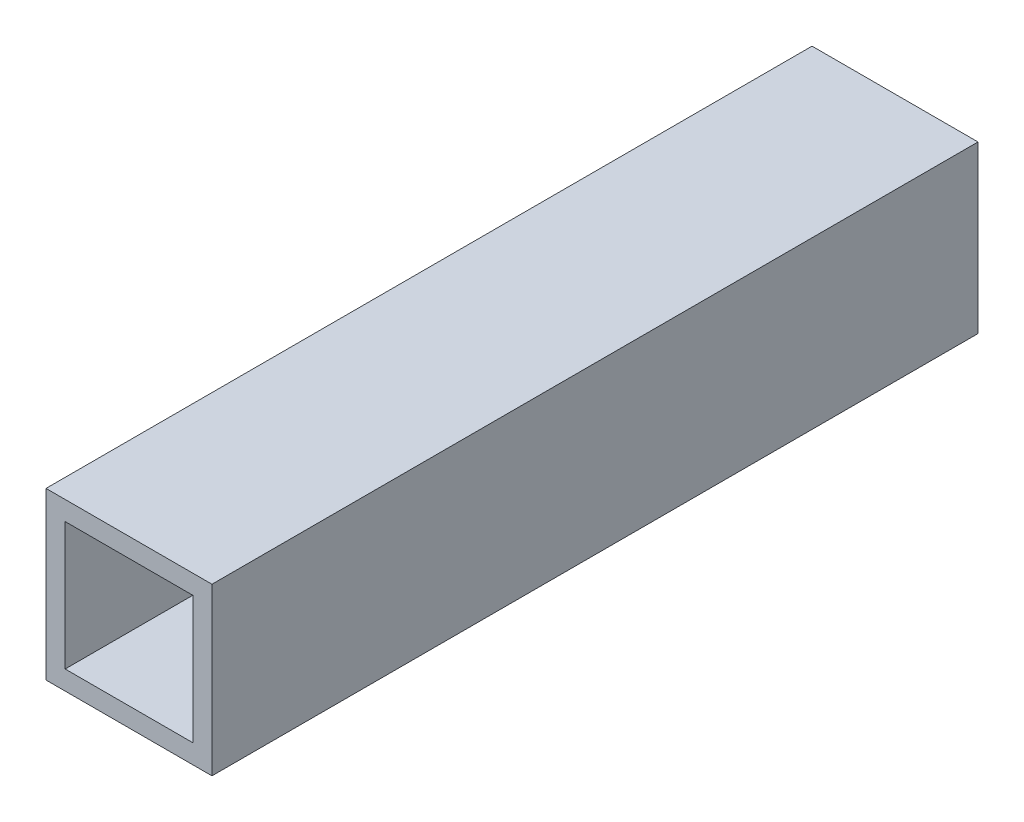
ISO-10303-21;
HEADER;
FILE_DESCRIPTION(('STEP AP214'),'2;1');
FILE_NAME('part.step','',(''),(''),'','','');
FILE_SCHEMA(('AUTOMOTIVE_DESIGN { 1 0 10303 214 1 1 1 1 }'));
ENDSEC;
DATA;
#1=APPLICATION_CONTEXT('core data for automotive mechanical design processes');
#2=APPLICATION_PROTOCOL_DEFINITION('international standard','automotive_design',2000,#1);
#3=PRODUCT_CONTEXT('',#1,'mechanical');
#4=PRODUCT('Part','Part','',(#3));
#5=PRODUCT_RELATED_PRODUCT_CATEGORY('part','',(#4));
#6=PRODUCT_DEFINITION_FORMATION('','',#4);
#7=PRODUCT_DEFINITION_CONTEXT('part definition',#1,'design');
#8=PRODUCT_DEFINITION('design','',#6,#7);
#9=PRODUCT_DEFINITION_SHAPE('','',#8);
#10=(LENGTH_UNIT() NAMED_UNIT(*) SI_UNIT(.MILLI.,.METRE.));
#11=(NAMED_UNIT(*) PLANE_ANGLE_UNIT() SI_UNIT($,.RADIAN.));
#12=(NAMED_UNIT(*) SI_UNIT($,.STERADIAN.) SOLID_ANGLE_UNIT());
#13=UNCERTAINTY_MEASURE_WITH_UNIT(LENGTH_MEASURE(1.E-05),#10,'distance_accuracy_value','');
#14=(GEOMETRIC_REPRESENTATION_CONTEXT(3) GLOBAL_UNCERTAINTY_ASSIGNED_CONTEXT((#13)) GLOBAL_UNIT_ASSIGNED_CONTEXT((#10,
#11,#12)) REPRESENTATION_CONTEXT('',''));
#15=CARTESIAN_POINT('',(0.,0.,0.));
#16=DIRECTION('',(0.,0.,1.));
#17=DIRECTION('',(1.,0.,0.));
#18=AXIS2_PLACEMENT_3D('',#15,#16,#17);
#19=CARTESIAN_POINT('',(0.,0.,60.));
#20=DIRECTION('',(0.,0.,1.));
#21=DIRECTION('',(1.,0.,0.));
#22=AXIS2_PLACEMENT_3D('',#19,#20,#21);
#23=PLANE('',#22);
#24=DIRECTION('',(0.,1.,0.));
#25=VECTOR('',#24,1.);
#26=CARTESIAN_POINT('',(6.5,6.5,60.));
#27=LINE('',#26,#25);
#28=CARTESIAN_POINT('',(6.5,-6.5,60.));
#29=VERTEX_POINT('',#28);
#30=CARTESIAN_POINT('',(6.5,6.5,60.));
#31=VERTEX_POINT('',#30);
#32=EDGE_CURVE('E136',#29,#31,#27,.T.);
#33=ORIENTED_EDGE('',*,*,#32,.T.);
#34=DIRECTION('',(-1.,0.,0.));
#35=VECTOR('',#34,1.);
#36=CARTESIAN_POINT('',(-6.5,6.5,60.));
#37=LINE('',#36,#35);
#38=CARTESIAN_POINT('',(-6.5,6.5,60.));
#39=VERTEX_POINT('',#38);
#40=EDGE_CURVE('E139',#31,#39,#37,.T.);
#41=ORIENTED_EDGE('',*,*,#40,.T.);
#42=DIRECTION('',(0.,-1.,0.));
#43=VECTOR('',#42,1.);
#44=CARTESIAN_POINT('',(-6.5,6.5,60.));
#45=LINE('',#44,#43);
#46=CARTESIAN_POINT('',(-6.5,-6.5,60.));
#47=VERTEX_POINT('',#46);
#48=EDGE_CURVE('E142',#39,#47,#45,.T.);
#49=ORIENTED_EDGE('',*,*,#48,.T.);
#50=DIRECTION('',(1.,0.,0.));
#51=VECTOR('',#50,1.);
#52=CARTESIAN_POINT('',(-6.5,-6.5,60.));
#53=LINE('',#52,#51);
#54=EDGE_CURVE('E144',#47,#29,#53,.T.);
#55=ORIENTED_EDGE('',*,*,#54,.T.);
#56=EDGE_LOOP('',(#33,#41,#49,#55));
#57=FACE_BOUND('',#56,.T.);
#58=DIRECTION('',(-1.,0.,0.));
#59=VECTOR('',#58,1.);
#60=CARTESIAN_POINT('',(-5.,5.00000000000001,60.));
#61=LINE('',#60,#59);
#62=CARTESIAN_POINT('',(5.,5.00000000000001,60.));
#63=VERTEX_POINT('',#62);
#64=CARTESIAN_POINT('',(-5.,5.00000000000001,60.));
#65=VERTEX_POINT('',#64);
#66=EDGE_CURVE('E108',#63,#65,#61,.T.);
#67=ORIENTED_EDGE('',*,*,#66,.F.);
#68=DIRECTION('',(0.,1.,0.));
#69=VECTOR('',#68,1.);
#70=CARTESIAN_POINT('',(5.,-5.,60.));
#71=LINE('',#70,#69);
#72=CARTESIAN_POINT('',(5.,-5.,60.));
#73=VERTEX_POINT('',#72);
#74=EDGE_CURVE('E100',#73,#63,#71,.T.);
#75=ORIENTED_EDGE('',*,*,#74,.F.);
#76=DIRECTION('',(1.,0.,0.));
#77=VECTOR('',#76,1.);
#78=CARTESIAN_POINT('',(-5.,-5.,60.));
#79=LINE('',#78,#77);
#80=CARTESIAN_POINT('',(-5.,-5.,60.));
#81=VERTEX_POINT('',#80);
#82=EDGE_CURVE('E122',#81,#73,#79,.T.);
#83=ORIENTED_EDGE('',*,*,#82,.F.);
#84=DIRECTION('',(0.,-1.,0.));
#85=VECTOR('',#84,1.);
#86=CARTESIAN_POINT('',(-5.,-5.,60.));
#87=LINE('',#86,#85);
#88=EDGE_CURVE('E120',#65,#81,#87,.T.);
#89=ORIENTED_EDGE('',*,*,#88,.F.);
#90=EDGE_LOOP('',(#67,#75,#83,#89));
#91=FACE_BOUND('',#90,.T.);
#92=ADVANCED_FACE('F35',(#57,#91),#23,.T.);
#93=CARTESIAN_POINT('',(0.,0.,0.));
#94=DIRECTION('',(0.,0.,1.));
#95=DIRECTION('',(1.,0.,0.));
#96=AXIS2_PLACEMENT_3D('',#93,#94,#95);
#97=PLANE('',#96);
#98=DIRECTION('',(0.,1.,0.));
#99=VECTOR('',#98,1.);
#100=CARTESIAN_POINT('',(6.5,6.5,0.));
#101=LINE('',#100,#99);
#102=CARTESIAN_POINT('',(6.5,-6.5,0.));
#103=VERTEX_POINT('',#102);
#104=CARTESIAN_POINT('',(6.5,6.5,0.));
#105=VERTEX_POINT('',#104);
#106=EDGE_CURVE('E116',#103,#105,#101,.T.);
#107=ORIENTED_EDGE('',*,*,#106,.F.);
#108=DIRECTION('',(1.,0.,0.));
#109=VECTOR('',#108,1.);
#110=CARTESIAN_POINT('',(-6.5,-6.5,0.));
#111=LINE('',#110,#109);
#112=CARTESIAN_POINT('',(-6.5,-6.5,0.));
#113=VERTEX_POINT('',#112);
#114=EDGE_CURVE('E140',#113,#103,#111,.T.);
#115=ORIENTED_EDGE('',*,*,#114,.F.);
#116=DIRECTION('',(0.,-1.,0.));
#117=VECTOR('',#116,1.);
#118=CARTESIAN_POINT('',(-6.5,6.5,0.));
#119=LINE('',#118,#117);
#120=CARTESIAN_POINT('',(-6.5,6.5,0.));
#121=VERTEX_POINT('',#120);
#122=EDGE_CURVE('E151',#121,#113,#119,.T.);
#123=ORIENTED_EDGE('',*,*,#122,.F.);
#124=DIRECTION('',(-1.,0.,0.));
#125=VECTOR('',#124,1.);
#126=CARTESIAN_POINT('',(-6.5,6.5,0.));
#127=LINE('',#126,#125);
#128=EDGE_CURVE('E149',#105,#121,#127,.T.);
#129=ORIENTED_EDGE('',*,*,#128,.F.);
#130=EDGE_LOOP('',(#107,#115,#123,#129));
#131=FACE_BOUND('',#130,.T.);
#132=DIRECTION('',(0.,1.,0.));
#133=VECTOR('',#132,1.);
#134=CARTESIAN_POINT('',(5.,-5.,0.));
#135=LINE('',#134,#133);
#136=CARTESIAN_POINT('',(5.,-5.,0.));
#137=VERTEX_POINT('',#136);
#138=CARTESIAN_POINT('',(5.,5.00000000000001,0.));
#139=VERTEX_POINT('',#138);
#140=EDGE_CURVE('E58',#137,#139,#135,.T.);
#141=ORIENTED_EDGE('',*,*,#140,.T.);
#142=DIRECTION('',(-1.,0.,0.));
#143=VECTOR('',#142,1.);
#144=CARTESIAN_POINT('',(-5.,5.00000000000001,0.));
#145=LINE('',#144,#143);
#146=CARTESIAN_POINT('',(-5.,5.00000000000001,0.));
#147=VERTEX_POINT('',#146);
#148=EDGE_CURVE('E115',#139,#147,#145,.T.);
#149=ORIENTED_EDGE('',*,*,#148,.T.);
#150=DIRECTION('',(0.,-1.,0.));
#151=VECTOR('',#150,1.);
#152=CARTESIAN_POINT('',(-5.,-5.,0.));
#153=LINE('',#152,#151);
#154=CARTESIAN_POINT('',(-5.,-5.,0.));
#155=VERTEX_POINT('',#154);
#156=EDGE_CURVE('E128',#147,#155,#153,.T.);
#157=ORIENTED_EDGE('',*,*,#156,.T.);
#158=DIRECTION('',(1.,0.,0.));
#159=VECTOR('',#158,1.);
#160=CARTESIAN_POINT('',(-5.,-5.,0.));
#161=LINE('',#160,#159);
#162=EDGE_CURVE('E109',#155,#137,#161,.T.);
#163=ORIENTED_EDGE('',*,*,#162,.T.);
#164=EDGE_LOOP('',(#141,#149,#157,#163));
#165=FACE_BOUND('',#164,.T.);
#166=ADVANCED_FACE('F169',(#131,#165),#97,.F.);
#167=CARTESIAN_POINT('',(6.5,6.5,60.));
#168=DIRECTION('',(-1.,0.,0.));
#169=DIRECTION('',(0.,0.,1.));
#170=AXIS2_PLACEMENT_3D('',#167,#168,#169);
#171=PLANE('',#170);
#172=ORIENTED_EDGE('',*,*,#106,.T.);
#173=DIRECTION('',(0.,0.,-1.));
#174=VECTOR('',#173,1.);
#175=CARTESIAN_POINT('',(6.5,6.5,60.));
#176=LINE('',#175,#174);
#177=EDGE_CURVE('E11',#31,#105,#176,.T.);
#178=ORIENTED_EDGE('',*,*,#177,.F.);
#179=ORIENTED_EDGE('',*,*,#32,.F.);
#180=DIRECTION('',(0.,0.,-1.));
#181=VECTOR('',#180,1.);
#182=CARTESIAN_POINT('',(6.5,-6.5,60.));
#183=LINE('',#182,#181);
#184=EDGE_CURVE('E146',#29,#103,#183,.T.);
#185=ORIENTED_EDGE('',*,*,#184,.T.);
#186=EDGE_LOOP('',(#172,#178,#179,#185));
#187=FACE_BOUND('',#186,.T.);
#188=ADVANCED_FACE('F37',(#187),#171,.F.);
#189=CARTESIAN_POINT('',(-6.5,6.5,60.));
#190=DIRECTION('',(0.,-1.,0.));
#191=DIRECTION('',(0.,0.,-1.));
#192=AXIS2_PLACEMENT_3D('',#189,#190,#191);
#193=PLANE('',#192);
#194=ORIENTED_EDGE('',*,*,#128,.T.);
#195=DIRECTION('',(0.,0.,-1.));
#196=VECTOR('',#195,1.);
#197=CARTESIAN_POINT('',(-6.5,6.5,60.));
#198=LINE('',#197,#196);
#199=EDGE_CURVE('E43',#39,#121,#198,.T.);
#200=ORIENTED_EDGE('',*,*,#199,.F.);
#201=ORIENTED_EDGE('',*,*,#40,.F.);
#202=ORIENTED_EDGE('',*,*,#177,.T.);
#203=EDGE_LOOP('',(#194,#200,#201,#202));
#204=FACE_BOUND('',#203,.T.);
#205=ADVANCED_FACE('F179',(#204),#193,.F.);
#206=CARTESIAN_POINT('',(-6.5,6.5,60.));
#207=DIRECTION('',(1.,0.,0.));
#208=DIRECTION('',(0.,0.,-1.));
#209=AXIS2_PLACEMENT_3D('',#206,#207,#208);
#210=PLANE('',#209);
#211=ORIENTED_EDGE('',*,*,#122,.T.);
#212=DIRECTION('',(0.,0.,-1.));
#213=VECTOR('',#212,1.);
#214=CARTESIAN_POINT('',(-6.5,-6.5,60.));
#215=LINE('',#214,#213);
#216=EDGE_CURVE('E156',#47,#113,#215,.T.);
#217=ORIENTED_EDGE('',*,*,#216,.F.);
#218=ORIENTED_EDGE('',*,*,#48,.F.);
#219=ORIENTED_EDGE('',*,*,#199,.T.);
#220=EDGE_LOOP('',(#211,#217,#218,#219));
#221=FACE_BOUND('',#220,.T.);
#222=ADVANCED_FACE('F163',(#221),#210,.F.);
#223=CARTESIAN_POINT('',(-6.5,-6.5,60.));
#224=DIRECTION('',(0.,1.,0.));
#225=DIRECTION('',(0.,0.,1.));
#226=AXIS2_PLACEMENT_3D('',#223,#224,#225);
#227=PLANE('',#226);
#228=ORIENTED_EDGE('',*,*,#114,.T.);
#229=ORIENTED_EDGE('',*,*,#184,.F.);
#230=ORIENTED_EDGE('',*,*,#54,.F.);
#231=ORIENTED_EDGE('',*,*,#216,.T.);
#232=EDGE_LOOP('',(#228,#229,#230,#231));
#233=FACE_BOUND('',#232,.T.);
#234=ADVANCED_FACE('F173',(#233),#227,.F.);
#235=CARTESIAN_POINT('',(5.,-5.,60.));
#236=DIRECTION('',(-1.,0.,0.));
#237=DIRECTION('',(0.,0.,1.));
#238=AXIS2_PLACEMENT_3D('',#235,#236,#237);
#239=PLANE('',#238);
#240=ORIENTED_EDGE('',*,*,#140,.F.);
#241=DIRECTION('',(0.,0.,-1.));
#242=VECTOR('',#241,1.);
#243=CARTESIAN_POINT('',(5.,-5.,60.));
#244=LINE('',#243,#242);
#245=EDGE_CURVE('E104',#73,#137,#244,.T.);
#246=ORIENTED_EDGE('',*,*,#245,.F.);
#247=ORIENTED_EDGE('',*,*,#74,.T.);
#248=DIRECTION('',(0.,0.,-1.));
#249=VECTOR('',#248,1.);
#250=CARTESIAN_POINT('',(5.,5.00000000000001,60.));
#251=LINE('',#250,#249);
#252=EDGE_CURVE('E103',#63,#139,#251,.T.);
#253=ORIENTED_EDGE('',*,*,#252,.T.);
#254=EDGE_LOOP('',(#240,#246,#247,#253));
#255=FACE_BOUND('',#254,.T.);
#256=ADVANCED_FACE('F102',(#255),#239,.T.);
#257=CARTESIAN_POINT('',(-5.,5.00000000000001,60.));
#258=DIRECTION('',(0.,-1.,0.));
#259=DIRECTION('',(0.,0.,-1.));
#260=AXIS2_PLACEMENT_3D('',#257,#258,#259);
#261=PLANE('',#260);
#262=ORIENTED_EDGE('',*,*,#148,.F.);
#263=ORIENTED_EDGE('',*,*,#252,.F.);
#264=ORIENTED_EDGE('',*,*,#66,.T.);
#265=DIRECTION('',(0.,0.,-1.));
#266=VECTOR('',#265,1.);
#267=CARTESIAN_POINT('',(-5.,5.00000000000001,60.));
#268=LINE('',#267,#266);
#269=EDGE_CURVE('E117',#65,#147,#268,.T.);
#270=ORIENTED_EDGE('',*,*,#269,.T.);
#271=EDGE_LOOP('',(#262,#263,#264,#270));
#272=FACE_BOUND('',#271,.T.);
#273=ADVANCED_FACE('F112',(#272),#261,.T.);
#274=CARTESIAN_POINT('',(-5.,-5.,60.));
#275=DIRECTION('',(1.,0.,0.));
#276=DIRECTION('',(0.,0.,-1.));
#277=AXIS2_PLACEMENT_3D('',#274,#275,#276);
#278=PLANE('',#277);
#279=ORIENTED_EDGE('',*,*,#156,.F.);
#280=ORIENTED_EDGE('',*,*,#269,.F.);
#281=ORIENTED_EDGE('',*,*,#88,.T.);
#282=DIRECTION('',(0.,0.,-1.));
#283=VECTOR('',#282,1.);
#284=CARTESIAN_POINT('',(-5.,-5.,60.));
#285=LINE('',#284,#283);
#286=EDGE_CURVE('E50',#81,#155,#285,.T.);
#287=ORIENTED_EDGE('',*,*,#286,.T.);
#288=EDGE_LOOP('',(#279,#280,#281,#287));
#289=FACE_BOUND('',#288,.T.);
#290=ADVANCED_FACE('F202',(#289),#278,.T.);
#291=CARTESIAN_POINT('',(-5.,-5.,60.));
#292=DIRECTION('',(0.,1.,0.));
#293=DIRECTION('',(0.,0.,1.));
#294=AXIS2_PLACEMENT_3D('',#291,#292,#293);
#295=PLANE('',#294);
#296=ORIENTED_EDGE('',*,*,#162,.F.);
#297=ORIENTED_EDGE('',*,*,#286,.F.);
#298=ORIENTED_EDGE('',*,*,#82,.T.);
#299=ORIENTED_EDGE('',*,*,#245,.T.);
#300=EDGE_LOOP('',(#296,#297,#298,#299));
#301=FACE_BOUND('',#300,.T.);
#302=ADVANCED_FACE('F206',(#301),#295,.T.);
#303=CLOSED_SHELL('',(#92,#166,#188,#205,#222,#234,#256,#273,#290,#302));
#304=MANIFOLD_SOLID_BREP('B2',#303);
#305=ADVANCED_BREP_SHAPE_REPRESENTATION('',(#18,#304),#14);
#306=SHAPE_DEFINITION_REPRESENTATION(#9,#305);
ENDSEC;
END-ISO-10303-21;
